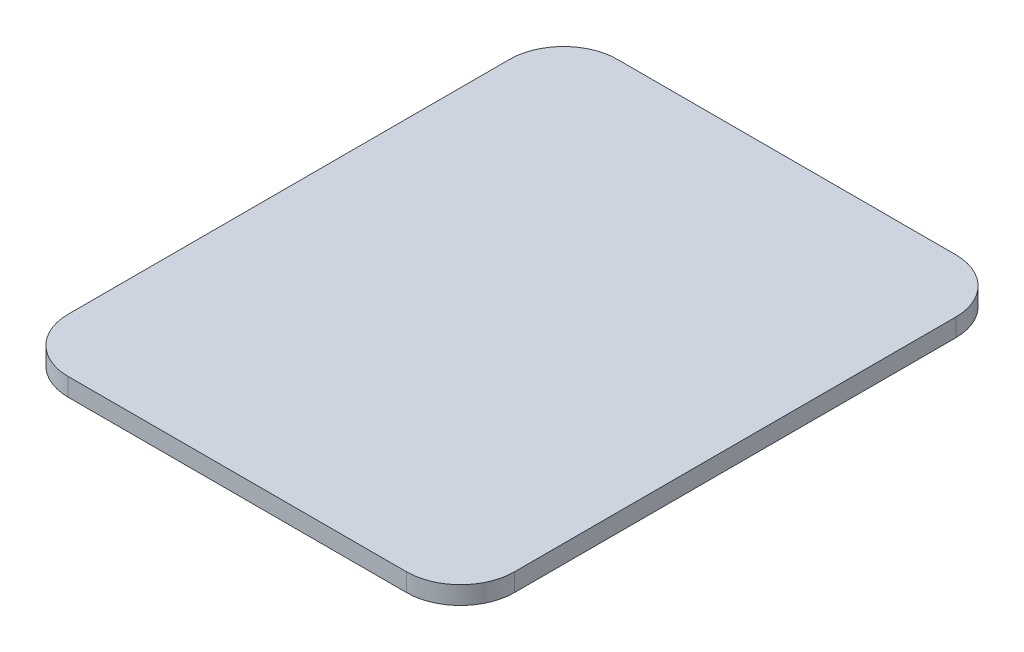
ISO-10303-21;
HEADER;
FILE_DESCRIPTION(('STEP AP214'),'2;1');
FILE_NAME('part.step','',(''),(''),'','','');
FILE_SCHEMA(('AUTOMOTIVE_DESIGN { 1 0 10303 214 1 1 1 1 }'));
ENDSEC;
DATA;
#1=APPLICATION_CONTEXT('core data for automotive mechanical design processes');
#2=APPLICATION_PROTOCOL_DEFINITION('international standard','automotive_design',2000,#1);
#3=PRODUCT_CONTEXT('',#1,'mechanical');
#4=PRODUCT('Part','Part','',(#3));
#5=PRODUCT_RELATED_PRODUCT_CATEGORY('part','',(#4));
#6=PRODUCT_DEFINITION_FORMATION('','',#4);
#7=PRODUCT_DEFINITION_CONTEXT('part definition',#1,'design');
#8=PRODUCT_DEFINITION('design','',#6,#7);
#9=PRODUCT_DEFINITION_SHAPE('','',#8);
#10=(LENGTH_UNIT() NAMED_UNIT(*) SI_UNIT(.MILLI.,.METRE.));
#11=(NAMED_UNIT(*) PLANE_ANGLE_UNIT() SI_UNIT($,.RADIAN.));
#12=(NAMED_UNIT(*) SI_UNIT($,.STERADIAN.) SOLID_ANGLE_UNIT());
#13=UNCERTAINTY_MEASURE_WITH_UNIT(LENGTH_MEASURE(1.E-05),#10,'distance_accuracy_value','');
#14=(GEOMETRIC_REPRESENTATION_CONTEXT(3) GLOBAL_UNCERTAINTY_ASSIGNED_CONTEXT((#13)) GLOBAL_UNIT_ASSIGNED_CONTEXT((#10,
#11,#12)) REPRESENTATION_CONTEXT('',''));
#15=CARTESIAN_POINT('',(0.,0.,0.));
#16=DIRECTION('',(0.,0.,1.));
#17=DIRECTION('',(1.,0.,0.));
#18=AXIS2_PLACEMENT_3D('',#15,#16,#17);
#19=CARTESIAN_POINT('',(-46.2288736461566,5.,-60.7334615523091));
#20=DIRECTION('',(0.,-1.,0.));
#21=DIRECTION('',(0.,0.,-1.));
#22=AXIS2_PLACEMENT_3D('',#19,#20,#21);
#23=CYLINDRICAL_SURFACE('',#22,14.9599999999999);
#24=CARTESIAN_POINT('',(-46.2288736461566,0.,-60.7334615523091));
#25=DIRECTION('',(0.,1.,0.));
#26=DIRECTION('',(0.,0.,-1.));
#27=AXIS2_PLACEMENT_3D('',#24,#25,#26);
#28=CIRCLE('',#27,14.9599999999999);
#29=CARTESIAN_POINT('',(-46.2288736461566,0.,-75.6934615523091));
#30=VERTEX_POINT('',#29);
#31=CARTESIAN_POINT('',(-61.1888736461565,0.,-60.7334615523091));
#32=VERTEX_POINT('',#31);
#33=EDGE_CURVE('E139',#30,#32,#28,.T.);
#34=ORIENTED_EDGE('',*,*,#33,.T.);
#35=DIRECTION('',(0.,-1.,0.));
#36=VECTOR('',#35,1.);
#37=CARTESIAN_POINT('',(-61.1888736461565,5.,-60.7334615523091));
#38=LINE('',#37,#36);
#39=CARTESIAN_POINT('',(-61.1888736461565,5.,-60.7334615523091));
#40=VERTEX_POINT('',#39);
#41=EDGE_CURVE('E11',#40,#32,#38,.T.);
#42=ORIENTED_EDGE('',*,*,#41,.F.);
#43=CARTESIAN_POINT('',(-46.2288736461566,5.,-60.7334615523091));
#44=DIRECTION('',(0.,1.,0.));
#45=DIRECTION('',(0.,0.,-1.));
#46=AXIS2_PLACEMENT_3D('',#43,#44,#45);
#47=CIRCLE('',#46,14.9599999999999);
#48=CARTESIAN_POINT('',(-46.2288736461566,5.,-75.6934615523091));
#49=VERTEX_POINT('',#48);
#50=EDGE_CURVE('E153',#49,#40,#47,.T.);
#51=ORIENTED_EDGE('',*,*,#50,.F.);
#52=DIRECTION('',(0.,-1.,0.));
#53=VECTOR('',#52,1.);
#54=CARTESIAN_POINT('',(-46.2288736461566,5.,-75.6934615523091));
#55=LINE('',#54,#53);
#56=EDGE_CURVE('E135',#49,#30,#55,.T.);
#57=ORIENTED_EDGE('',*,*,#56,.T.);
#58=EDGE_LOOP('',(#34,#42,#51,#57));
#59=FACE_BOUND('',#58,.T.);
#60=ADVANCED_FACE('F43',(#59),#23,.T.);
#61=CARTESIAN_POINT('',(-61.1888736461565,5.,61.7465384476908));
#62=DIRECTION('',(1.,0.,0.));
#63=DIRECTION('',(0.,0.,-1.));
#64=AXIS2_PLACEMENT_3D('',#61,#62,#63);
#65=PLANE('',#64);
#66=DIRECTION('',(0.,0.,1.));
#67=VECTOR('',#66,1.);
#68=CARTESIAN_POINT('',(-61.1888736461565,0.,61.7465384476908));
#69=LINE('',#68,#67);
#70=CARTESIAN_POINT('',(-61.1888736461565,0.,61.7465384476908));
#71=VERTEX_POINT('',#70);
#72=EDGE_CURVE('E142',#32,#71,#69,.T.);
#73=ORIENTED_EDGE('',*,*,#72,.T.);
#74=DIRECTION('',(0.,-1.,0.));
#75=VECTOR('',#74,1.);
#76=CARTESIAN_POINT('',(-61.1888736461565,5.,61.7465384476908));
#77=LINE('',#76,#75);
#78=CARTESIAN_POINT('',(-61.1888736461565,5.,61.7465384476908));
#79=VERTEX_POINT('',#78);
#80=EDGE_CURVE('E51',#79,#71,#77,.T.);
#81=ORIENTED_EDGE('',*,*,#80,.F.);
#82=DIRECTION('',(0.,0.,1.));
#83=VECTOR('',#82,1.);
#84=CARTESIAN_POINT('',(-61.1888736461565,5.,61.7465384476908));
#85=LINE('',#84,#83);
#86=EDGE_CURVE('E102',#40,#79,#85,.T.);
#87=ORIENTED_EDGE('',*,*,#86,.F.);
#88=ORIENTED_EDGE('',*,*,#41,.T.);
#89=EDGE_LOOP('',(#73,#81,#87,#88));
#90=FACE_BOUND('',#89,.T.);
#91=ADVANCED_FACE('F188',(#90),#65,.F.);
#92=CARTESIAN_POINT('',(-46.2288736461565,5.,61.7465384476909));
#93=DIRECTION('',(0.,-1.,0.));
#94=DIRECTION('',(0.,0.,-1.));
#95=AXIS2_PLACEMENT_3D('',#92,#93,#94);
#96=CYLINDRICAL_SURFACE('',#95,14.96);
#97=CARTESIAN_POINT('',(-46.2288736461565,0.,61.7465384476909));
#98=DIRECTION('',(0.,1.,0.));
#99=DIRECTION('',(0.,0.,-1.));
#100=AXIS2_PLACEMENT_3D('',#97,#98,#99);
#101=CIRCLE('',#100,14.96);
#102=CARTESIAN_POINT('',(-46.2288736461564,0.,76.7065384476909));
#103=VERTEX_POINT('',#102);
#104=EDGE_CURVE('E144',#71,#103,#101,.T.);
#105=ORIENTED_EDGE('',*,*,#104,.T.);
#106=DIRECTION('',(0.,-1.,0.));
#107=VECTOR('',#106,1.);
#108=CARTESIAN_POINT('',(-46.2288736461564,5.,76.7065384476909));
#109=LINE('',#108,#107);
#110=CARTESIAN_POINT('',(-46.2288736461564,5.,76.7065384476909));
#111=VERTEX_POINT('',#110);
#112=EDGE_CURVE('E160',#111,#103,#109,.T.);
#113=ORIENTED_EDGE('',*,*,#112,.F.);
#114=CARTESIAN_POINT('',(-46.2288736461565,5.,61.7465384476909));
#115=DIRECTION('',(0.,1.,0.));
#116=DIRECTION('',(0.,0.,-1.));
#117=AXIS2_PLACEMENT_3D('',#114,#115,#116);
#118=CIRCLE('',#117,14.96);
#119=EDGE_CURVE('E168',#79,#111,#118,.T.);
#120=ORIENTED_EDGE('',*,*,#119,.F.);
#121=ORIENTED_EDGE('',*,*,#80,.T.);
#122=EDGE_LOOP('',(#105,#113,#120,#121));
#123=FACE_BOUND('',#122,.T.);
#124=ADVANCED_FACE('F166',(#123),#96,.T.);
#125=CARTESIAN_POINT('',(-46.2288736461564,5.,76.7065384476909));
#126=DIRECTION('',(0.,0.,-1.));
#127=DIRECTION('',(-1.,0.,0.));
#128=AXIS2_PLACEMENT_3D('',#125,#126,#127);
#129=PLANE('',#128);
#130=DIRECTION('',(1.,0.,0.));
#131=VECTOR('',#130,1.);
#132=CARTESIAN_POINT('',(-46.2288736461564,0.,76.7065384476909));
#133=LINE('',#132,#131);
#134=CARTESIAN_POINT('',(47.6761263538436,0.,76.7065384476909));
#135=VERTEX_POINT('',#134);
#136=EDGE_CURVE('E146',#103,#135,#133,.T.);
#137=ORIENTED_EDGE('',*,*,#136,.T.);
#138=DIRECTION('',(0.,-1.,0.));
#139=VECTOR('',#138,1.);
#140=CARTESIAN_POINT('',(47.6761263538436,5.,76.7065384476909));
#141=LINE('',#140,#139);
#142=CARTESIAN_POINT('',(47.6761263538436,5.,76.7065384476909));
#143=VERTEX_POINT('',#142);
#144=EDGE_CURVE('E157',#143,#135,#141,.T.);
#145=ORIENTED_EDGE('',*,*,#144,.F.);
#146=DIRECTION('',(1.,0.,0.));
#147=VECTOR('',#146,1.);
#148=CARTESIAN_POINT('',(-46.2288736461564,5.,76.7065384476909));
#149=LINE('',#148,#147);
#150=EDGE_CURVE('E180',#111,#143,#149,.T.);
#151=ORIENTED_EDGE('',*,*,#150,.F.);
#152=ORIENTED_EDGE('',*,*,#112,.T.);
#153=EDGE_LOOP('',(#137,#145,#151,#152));
#154=FACE_BOUND('',#153,.T.);
#155=ADVANCED_FACE('F176',(#154),#129,.F.);
#156=CARTESIAN_POINT('',(47.6761263538437,5.,61.7465384476909));
#157=DIRECTION('',(0.,-1.,0.));
#158=DIRECTION('',(0.,0.,-1.));
#159=AXIS2_PLACEMENT_3D('',#156,#157,#158);
#160=CYLINDRICAL_SURFACE('',#159,14.96);
#161=CARTESIAN_POINT('',(47.6761263538437,0.,61.7465384476909));
#162=DIRECTION('',(0.,1.,0.));
#163=DIRECTION('',(0.,0.,1.));
#164=AXIS2_PLACEMENT_3D('',#161,#162,#163);
#165=CIRCLE('',#164,14.96);
#166=CARTESIAN_POINT('',(62.6361263538437,0.,61.7465384476909));
#167=VERTEX_POINT('',#166);
#168=EDGE_CURVE('E148',#135,#167,#165,.T.);
#169=ORIENTED_EDGE('',*,*,#168,.T.);
#170=DIRECTION('',(0.,-1.,0.));
#171=VECTOR('',#170,1.);
#172=CARTESIAN_POINT('',(62.6361263538437,5.,61.7465384476909));
#173=LINE('',#172,#171);
#174=CARTESIAN_POINT('',(62.6361263538437,5.,61.7465384476909));
#175=VERTEX_POINT('',#174);
#176=EDGE_CURVE('E130',#175,#167,#173,.T.);
#177=ORIENTED_EDGE('',*,*,#176,.F.);
#178=CARTESIAN_POINT('',(47.6761263538437,5.,61.7465384476909));
#179=DIRECTION('',(0.,1.,0.));
#180=DIRECTION('',(0.,0.,1.));
#181=AXIS2_PLACEMENT_3D('',#178,#179,#180);
#182=CIRCLE('',#181,14.96);
#183=EDGE_CURVE('E121',#143,#175,#182,.T.);
#184=ORIENTED_EDGE('',*,*,#183,.F.);
#185=ORIENTED_EDGE('',*,*,#144,.T.);
#186=EDGE_LOOP('',(#169,#177,#184,#185));
#187=FACE_BOUND('',#186,.T.);
#188=ADVANCED_FACE('F179',(#187),#160,.T.);
#189=CARTESIAN_POINT('',(62.6361263538437,5.,61.7465384476909));
#190=DIRECTION('',(-1.,0.,0.));
#191=DIRECTION('',(0.,0.,1.));
#192=AXIS2_PLACEMENT_3D('',#189,#190,#191);
#193=PLANE('',#192);
#194=DIRECTION('',(0.,0.,-1.));
#195=VECTOR('',#194,1.);
#196=CARTESIAN_POINT('',(62.6361263538437,0.,61.7465384476909));
#197=LINE('',#196,#195);
#198=CARTESIAN_POINT('',(62.636126353844,0.,-60.7334615523096));
#199=VERTEX_POINT('',#198);
#200=EDGE_CURVE('E129',#167,#199,#197,.T.);
#201=ORIENTED_EDGE('',*,*,#200,.T.);
#202=DIRECTION('',(0.,-1.,0.));
#203=VECTOR('',#202,1.);
#204=CARTESIAN_POINT('',(62.636126353844,5.,-60.7334615523096));
#205=LINE('',#204,#203);
#206=CARTESIAN_POINT('',(62.636126353844,5.,-60.7334615523096));
#207=VERTEX_POINT('',#206);
#208=EDGE_CURVE('E126',#207,#199,#205,.T.);
#209=ORIENTED_EDGE('',*,*,#208,.F.);
#210=DIRECTION('',(0.,0.,-1.));
#211=VECTOR('',#210,1.);
#212=CARTESIAN_POINT('',(62.6361263538437,5.,61.7465384476909));
#213=LINE('',#212,#211);
#214=EDGE_CURVE('E115',#175,#207,#213,.T.);
#215=ORIENTED_EDGE('',*,*,#214,.F.);
#216=ORIENTED_EDGE('',*,*,#176,.T.);
#217=EDGE_LOOP('',(#201,#209,#215,#216));
#218=FACE_BOUND('',#217,.T.);
#219=ADVANCED_FACE('F127',(#218),#193,.F.);
#220=CARTESIAN_POINT('',(47.676126353844,5.,-60.7334615523096));
#221=DIRECTION('',(0.,-1.,0.));
#222=DIRECTION('',(0.,0.,-1.));
#223=AXIS2_PLACEMENT_3D('',#220,#221,#222);
#224=CYLINDRICAL_SURFACE('',#223,14.96);
#225=CARTESIAN_POINT('',(47.676126353844,0.,-60.7334615523096));
#226=DIRECTION('',(0.,1.,0.));
#227=DIRECTION('',(0.,0.,-1.));
#228=AXIS2_PLACEMENT_3D('',#225,#226,#227);
#229=CIRCLE('',#228,14.96);
#230=CARTESIAN_POINT('',(47.676126353844,0.,-75.6934615523096));
#231=VERTEX_POINT('',#230);
#232=EDGE_CURVE('E88',#199,#231,#229,.T.);
#233=ORIENTED_EDGE('',*,*,#232,.T.);
#234=DIRECTION('',(0.,-1.,0.));
#235=VECTOR('',#234,1.);
#236=CARTESIAN_POINT('',(47.676126353844,5.,-75.6934615523096));
#237=LINE('',#236,#235);
#238=CARTESIAN_POINT('',(47.676126353844,5.,-75.6934615523096));
#239=VERTEX_POINT('',#238);
#240=EDGE_CURVE('E131',#239,#231,#237,.T.);
#241=ORIENTED_EDGE('',*,*,#240,.F.);
#242=CARTESIAN_POINT('',(47.676126353844,5.,-60.7334615523096));
#243=DIRECTION('',(0.,1.,0.));
#244=DIRECTION('',(0.,0.,-1.));
#245=AXIS2_PLACEMENT_3D('',#242,#243,#244);
#246=CIRCLE('',#245,14.96);
#247=EDGE_CURVE('E119',#207,#239,#246,.T.);
#248=ORIENTED_EDGE('',*,*,#247,.F.);
#249=ORIENTED_EDGE('',*,*,#208,.T.);
#250=EDGE_LOOP('',(#233,#241,#248,#249));
#251=FACE_BOUND('',#250,.T.);
#252=ADVANCED_FACE('F133',(#251),#224,.T.);
#253=CARTESIAN_POINT('',(-46.2288736461566,5.,-75.6934615523091));
#254=DIRECTION('',(0.,0.,1.));
#255=DIRECTION('',(1.,0.,0.));
#256=AXIS2_PLACEMENT_3D('',#253,#254,#255);
#257=PLANE('',#256);
#258=DIRECTION('',(-1.,0.,0.));
#259=VECTOR('',#258,1.);
#260=CARTESIAN_POINT('',(-46.2288736461566,0.,-75.6934615523091));
#261=LINE('',#260,#259);
#262=EDGE_CURVE('E94',#231,#30,#261,.T.);
#263=ORIENTED_EDGE('',*,*,#262,.T.);
#264=ORIENTED_EDGE('',*,*,#56,.F.);
#265=DIRECTION('',(-1.,0.,0.));
#266=VECTOR('',#265,1.);
#267=CARTESIAN_POINT('',(-46.2288736461566,5.,-75.6934615523091));
#268=LINE('',#267,#266);
#269=EDGE_CURVE('E59',#239,#49,#268,.T.);
#270=ORIENTED_EDGE('',*,*,#269,.F.);
#271=ORIENTED_EDGE('',*,*,#240,.T.);
#272=EDGE_LOOP('',(#263,#264,#270,#271));
#273=FACE_BOUND('',#272,.T.);
#274=ADVANCED_FACE('F204',(#273),#257,.F.);
#275=CARTESIAN_POINT('',(-46.2288736461566,5.,-60.7334615523091));
#276=DIRECTION('',(0.,-1.,0.));
#277=DIRECTION('',(0.,0.,-1.));
#278=AXIS2_PLACEMENT_3D('',#275,#276,#277);
#279=PLANE('',#278);
#280=ORIENTED_EDGE('',*,*,#50,.T.);
#281=ORIENTED_EDGE('',*,*,#86,.T.);
#282=ORIENTED_EDGE('',*,*,#119,.T.);
#283=ORIENTED_EDGE('',*,*,#150,.T.);
#284=ORIENTED_EDGE('',*,*,#183,.T.);
#285=ORIENTED_EDGE('',*,*,#214,.T.);
#286=ORIENTED_EDGE('',*,*,#247,.T.);
#287=ORIENTED_EDGE('',*,*,#269,.T.);
#288=EDGE_LOOP('',(#280,#281,#282,#283,#284,#285,#286,#287));
#289=FACE_BOUND('',#288,.T.);
#290=ADVANCED_FACE('F117',(#289),#279,.F.);
#291=CARTESIAN_POINT('',(-46.2288736461566,0.,-60.7334615523091));
#292=DIRECTION('',(0.,-1.,0.));
#293=DIRECTION('',(0.,0.,-1.));
#294=AXIS2_PLACEMENT_3D('',#291,#292,#293);
#295=PLANE('',#294);
#296=ORIENTED_EDGE('',*,*,#33,.F.);
#297=ORIENTED_EDGE('',*,*,#262,.F.);
#298=ORIENTED_EDGE('',*,*,#232,.F.);
#299=ORIENTED_EDGE('',*,*,#200,.F.);
#300=ORIENTED_EDGE('',*,*,#168,.F.);
#301=ORIENTED_EDGE('',*,*,#136,.F.);
#302=ORIENTED_EDGE('',*,*,#104,.F.);
#303=ORIENTED_EDGE('',*,*,#72,.F.);
#304=EDGE_LOOP('',(#296,#297,#298,#299,#300,#301,#302,#303));
#305=FACE_BOUND('',#304,.T.);
#306=ADVANCED_FACE('F172',(#305),#295,.T.);
#307=CLOSED_SHELL('',(#60,#91,#124,#155,#188,#219,#252,#274,#290,#306));
#308=MANIFOLD_SOLID_BREP('B2',#307);
#309=ADVANCED_BREP_SHAPE_REPRESENTATION('',(#18,#308),#14);
#310=SHAPE_DEFINITION_REPRESENTATION(#9,#309);
ENDSEC;
END-ISO-10303-21;
